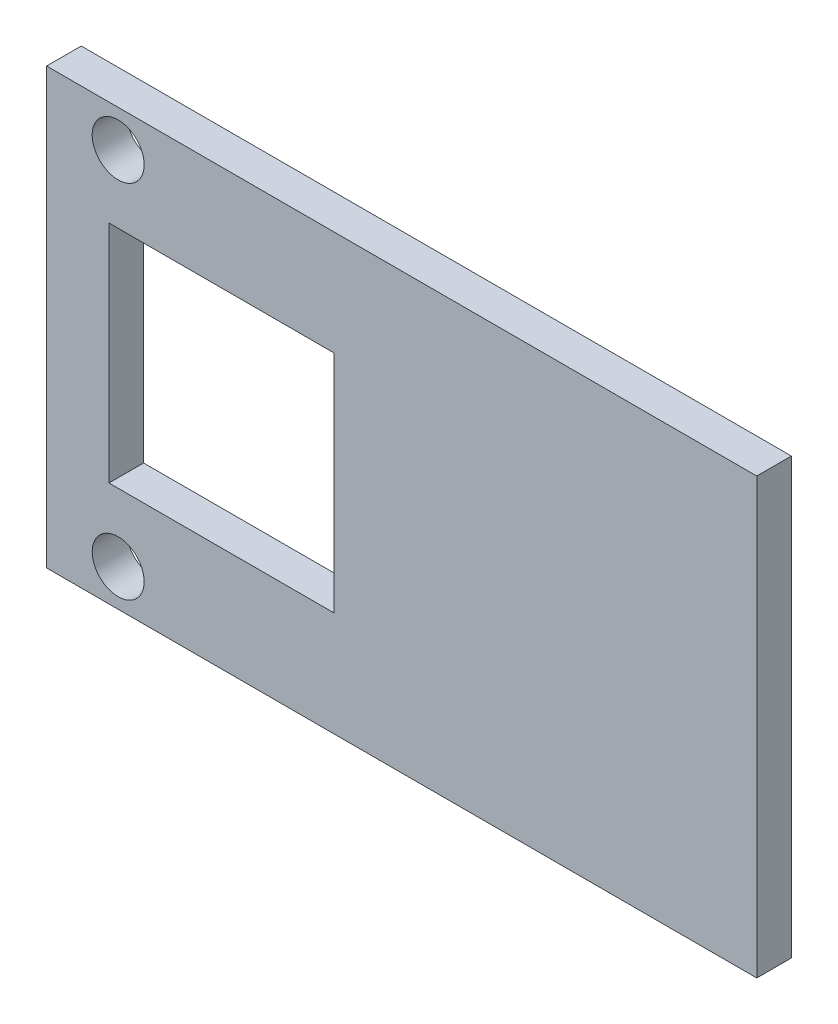
ISO-10303-21;
HEADER;
FILE_DESCRIPTION(('STEP AP214'),'2;1');
FILE_NAME('part.step','',(''),(''),'','','');
FILE_SCHEMA(('AUTOMOTIVE_DESIGN { 1 0 10303 214 1 1 1 1 }'));
ENDSEC;
DATA;
#1=APPLICATION_CONTEXT('core data for automotive mechanical design processes');
#2=APPLICATION_PROTOCOL_DEFINITION('international standard','automotive_design',2000,#1);
#3=PRODUCT_CONTEXT('',#1,'mechanical');
#4=PRODUCT('Part','Part','',(#3));
#5=PRODUCT_RELATED_PRODUCT_CATEGORY('part','',(#4));
#6=PRODUCT_DEFINITION_FORMATION('','',#4);
#7=PRODUCT_DEFINITION_CONTEXT('part definition',#1,'design');
#8=PRODUCT_DEFINITION('design','',#6,#7);
#9=PRODUCT_DEFINITION_SHAPE('','',#8);
#10=(LENGTH_UNIT() NAMED_UNIT(*) SI_UNIT(.MILLI.,.METRE.));
#11=(NAMED_UNIT(*) PLANE_ANGLE_UNIT() SI_UNIT($,.RADIAN.));
#12=(NAMED_UNIT(*) SI_UNIT($,.STERADIAN.) SOLID_ANGLE_UNIT());
#13=UNCERTAINTY_MEASURE_WITH_UNIT(LENGTH_MEASURE(1.E-05),#10,'distance_accuracy_value','');
#14=(GEOMETRIC_REPRESENTATION_CONTEXT(3) GLOBAL_UNCERTAINTY_ASSIGNED_CONTEXT((#13)) GLOBAL_UNIT_ASSIGNED_CONTEXT((#10,
#11,#12)) REPRESENTATION_CONTEXT('',''));
#15=CARTESIAN_POINT('',(0.,0.,0.));
#16=DIRECTION('',(0.,0.,1.));
#17=DIRECTION('',(1.,0.,0.));
#18=AXIS2_PLACEMENT_3D('',#15,#16,#17);
#19=CARTESIAN_POINT('',(0.,0.,2.));
#20=DIRECTION('',(0.,1.,0.));
#21=DIRECTION('',(0.,0.,1.));
#22=AXIS2_PLACEMENT_3D('',#19,#20,#21);
#23=PLANE('',#22);
#24=DIRECTION('',(1.,0.,0.));
#25=VECTOR('',#24,1.);
#26=CARTESIAN_POINT('',(0.,0.,0.));
#27=LINE('',#26,#25);
#28=CARTESIAN_POINT('',(-2.00285731899973,0.,0.));
#29=VERTEX_POINT('',#28);
#30=CARTESIAN_POINT('',(39.,0.,0.));
#31=VERTEX_POINT('',#30);
#32=EDGE_CURVE('E99',#29,#31,#27,.T.);
#33=ORIENTED_EDGE('',*,*,#32,.T.);
#34=DIRECTION('',(0.,0.,1.));
#35=VECTOR('',#34,1.);
#36=CARTESIAN_POINT('',(39.,0.,0.));
#37=LINE('',#36,#35);
#38=CARTESIAN_POINT('',(39.,0.,2.));
#39=VERTEX_POINT('',#38);
#40=EDGE_CURVE('E101',#31,#39,#37,.T.);
#41=ORIENTED_EDGE('',*,*,#40,.T.);
#42=DIRECTION('',(1.,0.,0.));
#43=VECTOR('',#42,1.);
#44=CARTESIAN_POINT('',(0.,0.,2.));
#45=LINE('',#44,#43);
#46=CARTESIAN_POINT('',(-2.00285731899973,0.,2.));
#47=VERTEX_POINT('',#46);
#48=EDGE_CURVE('E41',#47,#39,#45,.T.);
#49=ORIENTED_EDGE('',*,*,#48,.F.);
#50=DIRECTION('',(0.,0.,1.));
#51=VECTOR('',#50,1.);
#52=CARTESIAN_POINT('',(-2.00285731899973,0.,0.));
#53=LINE('',#52,#51);
#54=EDGE_CURVE('E104',#29,#47,#53,.T.);
#55=ORIENTED_EDGE('',*,*,#54,.F.);
#56=EDGE_LOOP('',(#33,#41,#49,#55));
#57=FACE_BOUND('',#56,.T.);
#58=ADVANCED_FACE('F33',(#57),#23,.F.);
#59=CARTESIAN_POINT('',(0.,25.1,2.));
#60=DIRECTION('',(0.,-1.,0.));
#61=DIRECTION('',(0.,0.,-1.));
#62=AXIS2_PLACEMENT_3D('',#59,#60,#61);
#63=PLANE('',#62);
#64=DIRECTION('',(-1.,0.,0.));
#65=VECTOR('',#64,1.);
#66=CARTESIAN_POINT('',(0.,25.1,0.));
#67=LINE('',#66,#65);
#68=CARTESIAN_POINT('',(39.,25.1,0.));
#69=VERTEX_POINT('',#68);
#70=CARTESIAN_POINT('',(-2.00285731899973,25.1,0.));
#71=VERTEX_POINT('',#70);
#72=EDGE_CURVE('E36',#69,#71,#67,.T.);
#73=ORIENTED_EDGE('',*,*,#72,.T.);
#74=DIRECTION('',(0.,0.,1.));
#75=VECTOR('',#74,1.);
#76=CARTESIAN_POINT('',(-2.00285731899973,25.1,0.));
#77=LINE('',#76,#75);
#78=CARTESIAN_POINT('',(-2.00285731899973,25.1,2.));
#79=VERTEX_POINT('',#78);
#80=EDGE_CURVE('E155',#71,#79,#77,.T.);
#81=ORIENTED_EDGE('',*,*,#80,.T.);
#82=DIRECTION('',(-1.,0.,0.));
#83=VECTOR('',#82,1.);
#84=CARTESIAN_POINT('',(0.,25.1,2.));
#85=LINE('',#84,#83);
#86=CARTESIAN_POINT('',(39.,25.1,2.));
#87=VERTEX_POINT('',#86);
#88=EDGE_CURVE('E11',#87,#79,#85,.T.);
#89=ORIENTED_EDGE('',*,*,#88,.F.);
#90=DIRECTION('',(0.,0.,1.));
#91=VECTOR('',#90,1.);
#92=CARTESIAN_POINT('',(39.,25.1,0.));
#93=LINE('',#92,#91);
#94=EDGE_CURVE('E117',#69,#87,#93,.T.);
#95=ORIENTED_EDGE('',*,*,#94,.F.);
#96=EDGE_LOOP('',(#73,#81,#89,#95));
#97=FACE_BOUND('',#96,.T.);
#98=ADVANCED_FACE('F175',(#97),#63,.F.);
#99=CARTESIAN_POINT('',(0.,0.,2.));
#100=DIRECTION('',(0.,0.,-1.));
#101=DIRECTION('',(-1.,0.,0.));
#102=AXIS2_PLACEMENT_3D('',#99,#100,#101);
#103=PLANE('',#102);
#104=DIRECTION('',(1.,0.,0.));
#105=VECTOR('',#104,1.);
#106=CARTESIAN_POINT('',(14.5971426810003,6.05,2.));
#107=LINE('',#106,#105);
#108=CARTESIAN_POINT('',(1.59714268100027,6.05,2.));
#109=VERTEX_POINT('',#108);
#110=CARTESIAN_POINT('',(14.5971426810003,6.05,2.));
#111=VERTEX_POINT('',#110);
#112=EDGE_CURVE('E124',#109,#111,#107,.T.);
#113=ORIENTED_EDGE('',*,*,#112,.F.);
#114=DIRECTION('',(0.,-1.,0.));
#115=VECTOR('',#114,1.);
#116=CARTESIAN_POINT('',(1.59714268100027,12.55,2.));
#117=LINE('',#116,#115);
#118=CARTESIAN_POINT('',(1.59714268100027,19.05,2.));
#119=VERTEX_POINT('',#118);
#120=EDGE_CURVE('E130',#119,#109,#117,.T.);
#121=ORIENTED_EDGE('',*,*,#120,.F.);
#122=DIRECTION('',(-1.,0.,0.));
#123=VECTOR('',#122,1.);
#124=CARTESIAN_POINT('',(1.59714268100027,19.05,2.));
#125=LINE('',#124,#123);
#126=CARTESIAN_POINT('',(14.5971426810003,19.05,2.));
#127=VERTEX_POINT('',#126);
#128=EDGE_CURVE('E141',#127,#119,#125,.T.);
#129=ORIENTED_EDGE('',*,*,#128,.F.);
#130=DIRECTION('',(0.,1.,0.));
#131=VECTOR('',#130,1.);
#132=CARTESIAN_POINT('',(14.5971426810003,19.05,2.));
#133=LINE('',#132,#131);
#134=EDGE_CURVE('E138',#111,#127,#133,.T.);
#135=ORIENTED_EDGE('',*,*,#134,.F.);
#136=EDGE_LOOP('',(#113,#121,#129,#135));
#137=FACE_BOUND('',#136,.T.);
#138=CARTESIAN_POINT('',(2.13,22.97,2.));
#139=DIRECTION('',(0.,0.,1.));
#140=DIRECTION('',(1.,0.,0.));
#141=AXIS2_PLACEMENT_3D('',#138,#139,#140);
#142=CIRCLE('',#141,1.5);
#143=CARTESIAN_POINT('',(3.63,22.97,2.));
#144=VERTEX_POINT('',#143);
#145=EDGE_CURVE('E164',#144,#144,#142,.T.);
#146=ORIENTED_EDGE('',*,*,#145,.F.);
#147=EDGE_LOOP('',(#146));
#148=FACE_BOUND('',#147,.T.);
#149=CARTESIAN_POINT('',(2.13,2.13,2.));
#150=DIRECTION('',(0.,0.,1.));
#151=DIRECTION('',(-1.,0.,0.));
#152=AXIS2_PLACEMENT_3D('',#149,#150,#151);
#153=CIRCLE('',#152,1.5);
#154=CARTESIAN_POINT('',(0.63,2.13,2.));
#155=VERTEX_POINT('',#154);
#156=EDGE_CURVE('E159',#155,#155,#153,.T.);
#157=ORIENTED_EDGE('',*,*,#156,.F.);
#158=EDGE_LOOP('',(#157));
#159=FACE_BOUND('',#158,.T.);
#160=ORIENTED_EDGE('',*,*,#88,.T.);
#161=DIRECTION('',(0.,-1.,0.));
#162=VECTOR('',#161,1.);
#163=CARTESIAN_POINT('',(-2.00285731899973,25.1,2.));
#164=LINE('',#163,#162);
#165=EDGE_CURVE('E147',#79,#47,#164,.T.);
#166=ORIENTED_EDGE('',*,*,#165,.T.);
#167=ORIENTED_EDGE('',*,*,#48,.T.);
#168=DIRECTION('',(0.,1.,0.));
#169=VECTOR('',#168,1.);
#170=CARTESIAN_POINT('',(39.,25.1,2.));
#171=LINE('',#170,#169);
#172=EDGE_CURVE('E116',#39,#87,#171,.T.);
#173=ORIENTED_EDGE('',*,*,#172,.T.);
#174=EDGE_LOOP('',(#160,#166,#167,#173));
#175=FACE_BOUND('',#174,.T.);
#176=ADVANCED_FACE('F179',(#137,#148,#159,#175),#103,.F.);
#177=CARTESIAN_POINT('',(0.,0.,0.));
#178=DIRECTION('',(0.,0.,-1.));
#179=DIRECTION('',(-1.,0.,0.));
#180=AXIS2_PLACEMENT_3D('',#177,#178,#179);
#181=PLANE('',#180);
#182=DIRECTION('',(0.,-1.,0.));
#183=VECTOR('',#182,1.);
#184=CARTESIAN_POINT('',(1.59714268100027,6.05,0.));
#185=LINE('',#184,#183);
#186=CARTESIAN_POINT('',(1.59714268100027,19.05,0.));
#187=VERTEX_POINT('',#186);
#188=CARTESIAN_POINT('',(1.59714268100027,6.05,0.));
#189=VERTEX_POINT('',#188);
#190=EDGE_CURVE('E126',#187,#189,#185,.T.);
#191=ORIENTED_EDGE('',*,*,#190,.T.);
#192=DIRECTION('',(1.,0.,0.));
#193=VECTOR('',#192,1.);
#194=CARTESIAN_POINT('',(14.5971426810003,6.05,0.));
#195=LINE('',#194,#193);
#196=CARTESIAN_POINT('',(14.5971426810003,6.05,0.));
#197=VERTEX_POINT('',#196);
#198=EDGE_CURVE('E129',#189,#197,#195,.T.);
#199=ORIENTED_EDGE('',*,*,#198,.T.);
#200=DIRECTION('',(0.,1.,0.));
#201=VECTOR('',#200,1.);
#202=CARTESIAN_POINT('',(14.5971426810003,19.05,0.));
#203=LINE('',#202,#201);
#204=CARTESIAN_POINT('',(14.5971426810003,19.05,0.));
#205=VERTEX_POINT('',#204);
#206=EDGE_CURVE('E57',#197,#205,#203,.T.);
#207=ORIENTED_EDGE('',*,*,#206,.T.);
#208=DIRECTION('',(-1.,0.,0.));
#209=VECTOR('',#208,1.);
#210=CARTESIAN_POINT('',(1.59714268100027,19.05,0.));
#211=LINE('',#210,#209);
#212=EDGE_CURVE('E134',#205,#187,#211,.T.);
#213=ORIENTED_EDGE('',*,*,#212,.T.);
#214=EDGE_LOOP('',(#191,#199,#207,#213));
#215=FACE_BOUND('',#214,.T.);
#216=CARTESIAN_POINT('',(2.13,22.97,0.));
#217=DIRECTION('',(0.,0.,1.));
#218=DIRECTION('',(1.,0.,0.));
#219=AXIS2_PLACEMENT_3D('',#216,#217,#218);
#220=CIRCLE('',#219,1.5);
#221=CARTESIAN_POINT('',(3.63,22.97,0.));
#222=VERTEX_POINT('',#221);
#223=EDGE_CURVE('E109',#222,#222,#220,.T.);
#224=ORIENTED_EDGE('',*,*,#223,.T.);
#225=EDGE_LOOP('',(#224));
#226=FACE_BOUND('',#225,.T.);
#227=CARTESIAN_POINT('',(2.13,2.13,0.));
#228=DIRECTION('',(0.,0.,1.));
#229=DIRECTION('',(-1.,0.,0.));
#230=AXIS2_PLACEMENT_3D('',#227,#228,#229);
#231=CIRCLE('',#230,1.5);
#232=CARTESIAN_POINT('',(0.63,2.13,0.));
#233=VERTEX_POINT('',#232);
#234=EDGE_CURVE('E167',#233,#233,#231,.T.);
#235=ORIENTED_EDGE('',*,*,#234,.T.);
#236=EDGE_LOOP('',(#235));
#237=FACE_BOUND('',#236,.T.);
#238=ORIENTED_EDGE('',*,*,#32,.F.);
#239=DIRECTION('',(0.,-1.,0.));
#240=VECTOR('',#239,1.);
#241=CARTESIAN_POINT('',(-2.00285731899973,25.1,0.));
#242=LINE('',#241,#240);
#243=EDGE_CURVE('E153',#71,#29,#242,.T.);
#244=ORIENTED_EDGE('',*,*,#243,.F.);
#245=ORIENTED_EDGE('',*,*,#72,.F.);
#246=DIRECTION('',(0.,1.,0.));
#247=VECTOR('',#246,1.);
#248=CARTESIAN_POINT('',(39.,25.1,0.));
#249=LINE('',#248,#247);
#250=EDGE_CURVE('E114',#31,#69,#249,.T.);
#251=ORIENTED_EDGE('',*,*,#250,.F.);
#252=EDGE_LOOP('',(#238,#244,#245,#251));
#253=FACE_BOUND('',#252,.T.);
#254=ADVANCED_FACE('F119',(#215,#226,#237,#253),#181,.T.);
#255=CARTESIAN_POINT('',(2.13,2.13,0.));
#256=DIRECTION('',(0.,0.,1.));
#257=DIRECTION('',(1.,0.,0.));
#258=AXIS2_PLACEMENT_3D('',#255,#256,#257);
#259=CYLINDRICAL_SURFACE('',#258,1.5);
#260=ORIENTED_EDGE('',*,*,#234,.F.);
#261=EDGE_LOOP('',(#260));
#262=FACE_BOUND('',#261,.T.);
#263=ORIENTED_EDGE('',*,*,#156,.T.);
#264=EDGE_LOOP('',(#263));
#265=FACE_BOUND('',#264,.T.);
#266=ADVANCED_FACE('F187',(#262,#265),#259,.F.);
#267=CARTESIAN_POINT('',(2.13,22.97,0.));
#268=DIRECTION('',(0.,0.,1.));
#269=DIRECTION('',(1.,0.,0.));
#270=AXIS2_PLACEMENT_3D('',#267,#268,#269);
#271=CYLINDRICAL_SURFACE('',#270,1.5);
#272=ORIENTED_EDGE('',*,*,#223,.F.);
#273=EDGE_LOOP('',(#272));
#274=FACE_BOUND('',#273,.T.);
#275=ORIENTED_EDGE('',*,*,#145,.T.);
#276=EDGE_LOOP('',(#275));
#277=FACE_BOUND('',#276,.T.);
#278=ADVANCED_FACE('F244',(#274,#277),#271,.F.);
#279=CARTESIAN_POINT('',(-2.00285731899973,25.1,0.));
#280=DIRECTION('',(-1.,0.,0.));
#281=DIRECTION('',(0.,0.,1.));
#282=AXIS2_PLACEMENT_3D('',#279,#280,#281);
#283=PLANE('',#282);
#284=ORIENTED_EDGE('',*,*,#165,.F.);
#285=ORIENTED_EDGE('',*,*,#80,.F.);
#286=ORIENTED_EDGE('',*,*,#243,.T.);
#287=ORIENTED_EDGE('',*,*,#54,.T.);
#288=EDGE_LOOP('',(#284,#285,#286,#287));
#289=FACE_BOUND('',#288,.T.);
#290=ADVANCED_FACE('F178',(#289),#283,.T.);
#291=CARTESIAN_POINT('',(1.59714268100027,12.55,0.));
#292=DIRECTION('',(-1.,0.,0.));
#293=DIRECTION('',(0.,0.,1.));
#294=AXIS2_PLACEMENT_3D('',#291,#292,#293);
#295=PLANE('',#294);
#296=ORIENTED_EDGE('',*,*,#120,.T.);
#297=DIRECTION('',(0.,0.,1.));
#298=VECTOR('',#297,1.);
#299=CARTESIAN_POINT('',(1.59714268100027,6.05,0.));
#300=LINE('',#299,#298);
#301=EDGE_CURVE('E49',#189,#109,#300,.T.);
#302=ORIENTED_EDGE('',*,*,#301,.F.);
#303=ORIENTED_EDGE('',*,*,#190,.F.);
#304=DIRECTION('',(0.,0.,1.));
#305=VECTOR('',#304,1.);
#306=CARTESIAN_POINT('',(1.59714268100027,19.05,0.));
#307=LINE('',#306,#305);
#308=EDGE_CURVE('E145',#187,#119,#307,.T.);
#309=ORIENTED_EDGE('',*,*,#308,.T.);
#310=EDGE_LOOP('',(#296,#302,#303,#309));
#311=FACE_BOUND('',#310,.T.);
#312=ADVANCED_FACE('F233',(#311),#295,.F.);
#313=CARTESIAN_POINT('',(1.59714268100027,19.05,0.));
#314=DIRECTION('',(0.,1.,0.));
#315=DIRECTION('',(0.,0.,1.));
#316=AXIS2_PLACEMENT_3D('',#313,#314,#315);
#317=PLANE('',#316);
#318=ORIENTED_EDGE('',*,*,#128,.T.);
#319=ORIENTED_EDGE('',*,*,#308,.F.);
#320=ORIENTED_EDGE('',*,*,#212,.F.);
#321=DIRECTION('',(0.,0.,1.));
#322=VECTOR('',#321,1.);
#323=CARTESIAN_POINT('',(14.5971426810003,19.05,0.));
#324=LINE('',#323,#322);
#325=EDGE_CURVE('E148',#205,#127,#324,.T.);
#326=ORIENTED_EDGE('',*,*,#325,.T.);
#327=EDGE_LOOP('',(#318,#319,#320,#326));
#328=FACE_BOUND('',#327,.T.);
#329=ADVANCED_FACE('F236',(#328),#317,.F.);
#330=CARTESIAN_POINT('',(14.5971426810003,19.05,0.));
#331=DIRECTION('',(1.,0.,0.));
#332=DIRECTION('',(0.,1.,0.));
#333=AXIS2_PLACEMENT_3D('',#330,#331,#332);
#334=PLANE('',#333);
#335=ORIENTED_EDGE('',*,*,#134,.T.);
#336=ORIENTED_EDGE('',*,*,#325,.F.);
#337=ORIENTED_EDGE('',*,*,#206,.F.);
#338=DIRECTION('',(0.,0.,1.));
#339=VECTOR('',#338,1.);
#340=CARTESIAN_POINT('',(14.5971426810003,6.05,0.));
#341=LINE('',#340,#339);
#342=EDGE_CURVE('E150',#197,#111,#341,.T.);
#343=ORIENTED_EDGE('',*,*,#342,.T.);
#344=EDGE_LOOP('',(#335,#336,#337,#343));
#345=FACE_BOUND('',#344,.T.);
#346=ADVANCED_FACE('F230',(#345),#334,.F.);
#347=CARTESIAN_POINT('',(14.5971426810003,6.05,0.));
#348=DIRECTION('',(0.,-1.,0.));
#349=DIRECTION('',(0.,0.,-1.));
#350=AXIS2_PLACEMENT_3D('',#347,#348,#349);
#351=PLANE('',#350);
#352=ORIENTED_EDGE('',*,*,#112,.T.);
#353=ORIENTED_EDGE('',*,*,#342,.F.);
#354=ORIENTED_EDGE('',*,*,#198,.F.);
#355=ORIENTED_EDGE('',*,*,#301,.T.);
#356=EDGE_LOOP('',(#352,#353,#354,#355));
#357=FACE_BOUND('',#356,.T.);
#358=ADVANCED_FACE('F201',(#357),#351,.F.);
#359=CARTESIAN_POINT('',(39.,25.1,0.));
#360=DIRECTION('',(1.,0.,0.));
#361=DIRECTION('',(0.,0.,-1.));
#362=AXIS2_PLACEMENT_3D('',#359,#360,#361);
#363=PLANE('',#362);
#364=ORIENTED_EDGE('',*,*,#172,.F.);
#365=ORIENTED_EDGE('',*,*,#40,.F.);
#366=ORIENTED_EDGE('',*,*,#250,.T.);
#367=ORIENTED_EDGE('',*,*,#94,.T.);
#368=EDGE_LOOP('',(#364,#365,#366,#367));
#369=FACE_BOUND('',#368,.T.);
#370=ADVANCED_FACE('F112',(#369),#363,.T.);
#371=CLOSED_SHELL('',(#58,#98,#176,#254,#266,#278,#290,#312,#329,#346,#358,#370));
#372=MANIFOLD_SOLID_BREP('B2',#371);
#373=ADVANCED_BREP_SHAPE_REPRESENTATION('',(#18,#372),#14);
#374=SHAPE_DEFINITION_REPRESENTATION(#9,#373);
ENDSEC;
END-ISO-10303-21;
